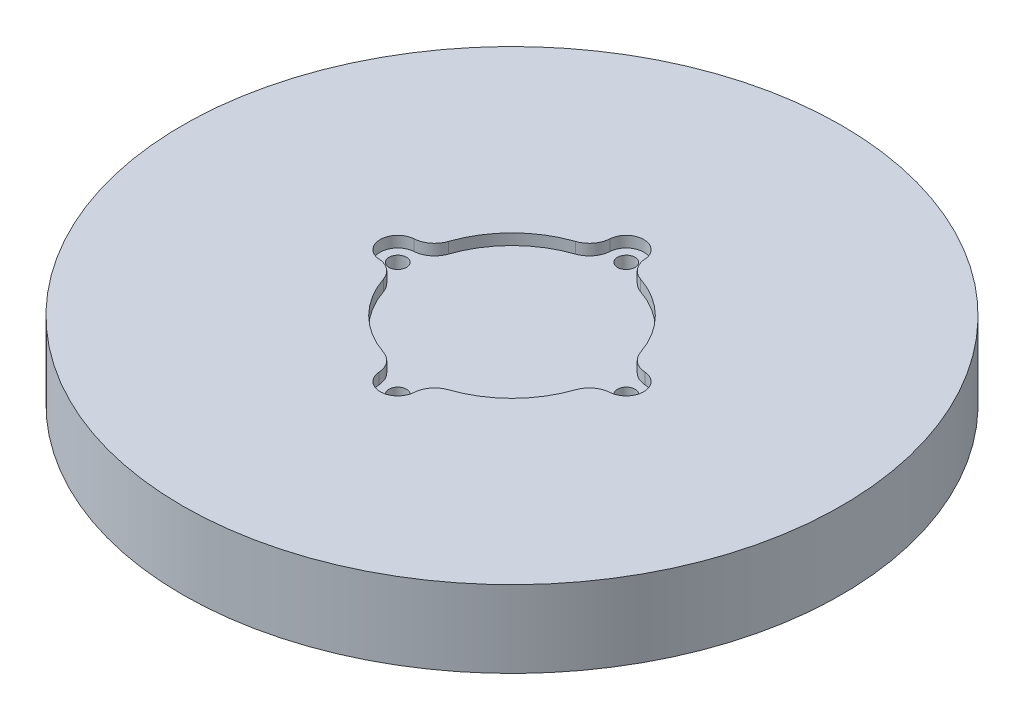
ISO-10303-21;
HEADER;
FILE_DESCRIPTION(('STEP AP214'),'2;1');
FILE_NAME('part.step','',(''),(''),'','','');
FILE_SCHEMA(('AUTOMOTIVE_DESIGN { 1 0 10303 214 1 1 1 1 }'));
ENDSEC;
DATA;
#1=APPLICATION_CONTEXT('core data for automotive mechanical design processes');
#2=APPLICATION_PROTOCOL_DEFINITION('international standard','automotive_design',2000,#1);
#3=PRODUCT_CONTEXT('',#1,'mechanical');
#4=PRODUCT('Part','Part','',(#3));
#5=PRODUCT_RELATED_PRODUCT_CATEGORY('part','',(#4));
#6=PRODUCT_DEFINITION_FORMATION('','',#4);
#7=PRODUCT_DEFINITION_CONTEXT('part definition',#1,'design');
#8=PRODUCT_DEFINITION('design','',#6,#7);
#9=PRODUCT_DEFINITION_SHAPE('','',#8);
#10=(LENGTH_UNIT() NAMED_UNIT(*) SI_UNIT(.MILLI.,.METRE.));
#11=(NAMED_UNIT(*) PLANE_ANGLE_UNIT() SI_UNIT($,.RADIAN.));
#12=(NAMED_UNIT(*) SI_UNIT($,.STERADIAN.) SOLID_ANGLE_UNIT());
#13=UNCERTAINTY_MEASURE_WITH_UNIT(LENGTH_MEASURE(1.E-05),#10,'distance_accuracy_value','');
#14=(GEOMETRIC_REPRESENTATION_CONTEXT(3) GLOBAL_UNCERTAINTY_ASSIGNED_CONTEXT((#13)) GLOBAL_UNIT_ASSIGNED_CONTEXT((#10,
#11,#12)) REPRESENTATION_CONTEXT('',''));
#15=CARTESIAN_POINT('',(0.,0.,0.));
#16=DIRECTION('',(0.,0.,1.));
#17=DIRECTION('',(1.,0.,0.));
#18=AXIS2_PLACEMENT_3D('',#15,#16,#17);
#19=CARTESIAN_POINT('',(0.,35.,0.));
#20=DIRECTION('',(0.,-1.,0.));
#21=DIRECTION('',(0.,0.,-1.));
#22=AXIS2_PLACEMENT_3D('',#19,#20,#21);
#23=CYLINDRICAL_SURFACE('',#22,150.);
#24=CARTESIAN_POINT('',(0.,35.,0.));
#25=DIRECTION('',(0.,1.,0.));
#26=DIRECTION('',(0.,0.,1.));
#27=AXIS2_PLACEMENT_3D('',#24,#25,#26);
#28=CIRCLE('',#27,150.);
#29=CARTESIAN_POINT('',(0.,35.,150.));
#30=VERTEX_POINT('',#29);
#31=EDGE_CURVE('E311',#30,#30,#28,.T.);
#32=ORIENTED_EDGE('',*,*,#31,.F.);
#33=EDGE_LOOP('',(#32));
#34=FACE_BOUND('',#33,.T.);
#35=CARTESIAN_POINT('',(0.,0.,0.));
#36=DIRECTION('',(0.,1.,0.));
#37=DIRECTION('',(0.,0.,1.));
#38=AXIS2_PLACEMENT_3D('',#35,#36,#37);
#39=CIRCLE('',#38,150.);
#40=CARTESIAN_POINT('',(0.,0.,150.));
#41=VERTEX_POINT('',#40);
#42=EDGE_CURVE('E287',#41,#41,#39,.T.);
#43=ORIENTED_EDGE('',*,*,#42,.T.);
#44=EDGE_LOOP('',(#43));
#45=FACE_BOUND('',#44,.T.);
#46=ADVANCED_FACE('F96',(#34,#45),#23,.T.);
#47=CARTESIAN_POINT('',(0.,35.,0.));
#48=DIRECTION('',(0.,1.,0.));
#49=DIRECTION('',(0.,0.,1.));
#50=AXIS2_PLACEMENT_3D('',#47,#48,#49);
#51=PLANE('',#50);
#52=CARTESIAN_POINT('',(0.,35.,0.));
#53=DIRECTION('',(0.,1.,0.));
#54=DIRECTION('',(0.,0.,1.));
#55=AXIS2_PLACEMENT_3D('',#52,#53,#54);
#56=CIRCLE('',#55,46.1388992574743);
#57=CARTESIAN_POINT('',(-43.7138322619308,35.,14.7613987706835));
#58=VERTEX_POINT('',#57);
#59=CARTESIAN_POINT('',(-14.761398770684,35.,43.7138322619306));
#60=VERTEX_POINT('',#59);
#61=EDGE_CURVE('E228',#58,#60,#56,.T.);
#62=ORIENTED_EDGE('',*,*,#61,.F.);
#63=CARTESIAN_POINT('',(-53.1882308638544,35.,17.9607379418044));
#64=DIRECTION('',(0.,1.,0.));
#65=DIRECTION('',(0.,0.,1.));
#66=AXIS2_PLACEMENT_3D('',#63,#64,#65);
#67=CIRCLE('',#66,10.);
#68=CARTESIAN_POINT('',(-52.5281026061575,35.,7.98255019635728));
#69=VERTEX_POINT('',#68);
#70=EDGE_CURVE('E210',#58,#69,#67,.T.);
#71=ORIENTED_EDGE('',*,*,#70,.T.);
#72=CARTESIAN_POINT('',(-52.,35.,-3.66583506191639E-13));
#73=DIRECTION('',(0.,1.,0.));
#74=DIRECTION('',(0.,0.,1.));
#75=AXIS2_PLACEMENT_3D('',#72,#73,#74);
#76=CIRCLE('',#75,7.99999999999999);
#77=CARTESIAN_POINT('',(-52.5281026061574,35.,-7.98255019635802));
#78=VERTEX_POINT('',#77);
#79=EDGE_CURVE('E241',#78,#69,#76,.T.);
#80=ORIENTED_EDGE('',*,*,#79,.F.);
#81=CARTESIAN_POINT('',(-53.1882308638542,35.,-17.9607379418051));
#82=DIRECTION('',(0.,1.,0.));
#83=DIRECTION('',(0.,0.,1.));
#84=AXIS2_PLACEMENT_3D('',#81,#82,#83);
#85=CIRCLE('',#84,10.);
#86=CARTESIAN_POINT('',(-43.7138322619306,35.,-14.7613987706841));
#87=VERTEX_POINT('',#86);
#88=EDGE_CURVE('E233',#78,#87,#85,.T.);
#89=ORIENTED_EDGE('',*,*,#88,.T.);
#90=CARTESIAN_POINT('',(-14.7613987706834,35.,-43.7138322619309));
#91=VERTEX_POINT('',#90);
#92=EDGE_CURVE('E244',#91,#87,#56,.T.);
#93=ORIENTED_EDGE('',*,*,#92,.F.);
#94=CARTESIAN_POINT('',(-17.9607379418042,35.,-53.1882308638545));
#95=DIRECTION('',(0.,1.,0.));
#96=DIRECTION('',(0.,0.,1.));
#97=AXIS2_PLACEMENT_3D('',#94,#95,#96);
#98=CIRCLE('',#97,10.);
#99=CARTESIAN_POINT('',(-7.98255019635711,35.,-52.5281026061575));
#100=VERTEX_POINT('',#99);
#101=EDGE_CURVE('E322',#91,#100,#98,.T.);
#102=ORIENTED_EDGE('',*,*,#101,.T.);
#103=CARTESIAN_POINT('',(5.44671088859529E-13,35.,-52.));
#104=DIRECTION('',(0.,1.,0.));
#105=DIRECTION('',(0.,0.,1.));
#106=AXIS2_PLACEMENT_3D('',#103,#104,#105);
#107=CIRCLE('',#106,8.);
#108=CARTESIAN_POINT('',(7.98255019635821,35.,-52.5281026061574));
#109=VERTEX_POINT('',#108);
#110=EDGE_CURVE('E259',#109,#100,#107,.T.);
#111=ORIENTED_EDGE('',*,*,#110,.F.);
#112=CARTESIAN_POINT('',(17.9607379418053,35.,-53.1882308638541));
#113=DIRECTION('',(0.,1.,0.));
#114=DIRECTION('',(0.,0.,1.));
#115=AXIS2_PLACEMENT_3D('',#112,#113,#114);
#116=CIRCLE('',#115,10.);
#117=CARTESIAN_POINT('',(14.7613987706843,35.,-43.7138322619305));
#118=VERTEX_POINT('',#117);
#119=EDGE_CURVE('E325',#109,#118,#116,.T.);
#120=ORIENTED_EDGE('',*,*,#119,.T.);
#121=CARTESIAN_POINT('',(43.7138322619307,35.,-14.7613987706838));
#122=VERTEX_POINT('',#121);
#123=EDGE_CURVE('E257',#122,#118,#56,.T.);
#124=ORIENTED_EDGE('',*,*,#123,.F.);
#125=CARTESIAN_POINT('',(53.1882308638543,35.,-17.9607379418047));
#126=DIRECTION('',(0.,1.,0.));
#127=DIRECTION('',(0.,0.,1.));
#128=AXIS2_PLACEMENT_3D('',#125,#126,#127);
#129=CIRCLE('',#128,10.);
#130=CARTESIAN_POINT('',(52.5281026061575,35.,-7.98255019635766));
#131=VERTEX_POINT('',#130);
#132=EDGE_CURVE('E328',#122,#131,#129,.T.);
#133=ORIENTED_EDGE('',*,*,#132,.T.);
#134=CARTESIAN_POINT('',(52.,35.,0.));
#135=DIRECTION('',(0.,1.,0.));
#136=DIRECTION('',(0.,0.,1.));
#137=AXIS2_PLACEMENT_3D('',#134,#135,#136);
#138=CIRCLE('',#137,8.);
#139=CARTESIAN_POINT('',(52.5281026061575,35.,7.98255019635766));
#140=VERTEX_POINT('',#139);
#141=EDGE_CURVE('E255',#140,#131,#138,.T.);
#142=ORIENTED_EDGE('',*,*,#141,.F.);
#143=CARTESIAN_POINT('',(53.1882308638543,35.,17.9607379418047));
#144=DIRECTION('',(0.,1.,0.));
#145=DIRECTION('',(0.,0.,1.));
#146=AXIS2_PLACEMENT_3D('',#143,#144,#145);
#147=CIRCLE('',#146,10.);
#148=CARTESIAN_POINT('',(43.7138322619307,35.,14.7613987706838));
#149=VERTEX_POINT('',#148);
#150=EDGE_CURVE('E331',#140,#149,#147,.T.);
#151=ORIENTED_EDGE('',*,*,#150,.T.);
#152=CARTESIAN_POINT('',(14.7613987706837,35.,43.7138322619307));
#153=VERTEX_POINT('',#152);
#154=EDGE_CURVE('E243',#153,#149,#56,.T.);
#155=ORIENTED_EDGE('',*,*,#154,.F.);
#156=CARTESIAN_POINT('',(17.9607379418045,35.,53.1882308638543));
#157=DIRECTION('',(0.,1.,0.));
#158=DIRECTION('',(0.,0.,1.));
#159=AXIS2_PLACEMENT_3D('',#156,#157,#158);
#160=CIRCLE('',#159,10.);
#161=CARTESIAN_POINT('',(7.98255019635747,35.,52.5281026061575));
#162=VERTEX_POINT('',#161);
#163=EDGE_CURVE('E334',#153,#162,#160,.T.);
#164=ORIENTED_EDGE('',*,*,#163,.T.);
#165=CARTESIAN_POINT('',(-1.81557029619843E-13,35.,52.));
#166=DIRECTION('',(0.,1.,0.));
#167=DIRECTION('',(0.,0.,1.));
#168=AXIS2_PLACEMENT_3D('',#165,#166,#167);
#169=CIRCLE('',#168,8.);
#170=CARTESIAN_POINT('',(-7.98255019635784,35.,52.5281026061574));
#171=VERTEX_POINT('',#170);
#172=EDGE_CURVE('E256',#171,#162,#169,.T.);
#173=ORIENTED_EDGE('',*,*,#172,.F.);
#174=CARTESIAN_POINT('',(-17.9607379418049,35.,53.1882308638542));
#175=DIRECTION('',(0.,1.,0.));
#176=DIRECTION('',(0.,0.,1.));
#177=AXIS2_PLACEMENT_3D('',#174,#175,#176);
#178=CIRCLE('',#177,10.);
#179=EDGE_CURVE('E222',#171,#60,#178,.T.);
#180=ORIENTED_EDGE('',*,*,#179,.T.);
#181=EDGE_LOOP('',(#62,#71,#80,#89,#93,#102,#111,#120,#124,#133,#142,#151,#155,#164,#173,#180));
#182=FACE_BOUND('',#181,.T.);
#183=ORIENTED_EDGE('',*,*,#31,.T.);
#184=EDGE_LOOP('',(#183));
#185=FACE_BOUND('',#184,.T.);
#186=ADVANCED_FACE('F236',(#182,#185),#51,.T.);
#187=CARTESIAN_POINT('',(0.,0.,0.));
#188=DIRECTION('',(0.,1.,0.));
#189=DIRECTION('',(0.,0.,1.));
#190=AXIS2_PLACEMENT_3D('',#187,#188,#189);
#191=PLANE('',#190);
#192=CARTESIAN_POINT('',(5.44671088859529E-13,0.,52.));
#193=DIRECTION('',(0.,-1.,0.));
#194=DIRECTION('',(0.,0.,-1.));
#195=AXIS2_PLACEMENT_3D('',#192,#193,#194);
#196=CIRCLE('',#195,4.);
#197=CARTESIAN_POINT('',(5.44671088859529E-13,0.,48.));
#198=VERTEX_POINT('',#197);
#199=EDGE_CURVE('E283',#198,#198,#196,.T.);
#200=ORIENTED_EDGE('',*,*,#199,.F.);
#201=EDGE_LOOP('',(#200));
#202=FACE_BOUND('',#201,.T.);
#203=CARTESIAN_POINT('',(-52.,0.,3.63114059239686E-13));
#204=DIRECTION('',(0.,-1.,0.));
#205=DIRECTION('',(0.,0.,-1.));
#206=AXIS2_PLACEMENT_3D('',#203,#204,#205);
#207=CIRCLE('',#206,4.);
#208=CARTESIAN_POINT('',(-52.,0.,-3.99999999999963));
#209=VERTEX_POINT('',#208);
#210=EDGE_CURVE('E288',#209,#209,#207,.T.);
#211=ORIENTED_EDGE('',*,*,#210,.F.);
#212=EDGE_LOOP('',(#211));
#213=FACE_BOUND('',#212,.T.);
#214=CARTESIAN_POINT('',(52.,0.,0.));
#215=DIRECTION('',(0.,-1.,0.));
#216=DIRECTION('',(0.,0.,-1.));
#217=AXIS2_PLACEMENT_3D('',#214,#215,#216);
#218=CIRCLE('',#217,4.);
#219=CARTESIAN_POINT('',(52.,0.,-4.));
#220=VERTEX_POINT('',#219);
#221=EDGE_CURVE('E292',#220,#220,#218,.T.);
#222=ORIENTED_EDGE('',*,*,#221,.F.);
#223=EDGE_LOOP('',(#222));
#224=FACE_BOUND('',#223,.T.);
#225=CARTESIAN_POINT('',(-1.81557029619843E-13,0.,-52.));
#226=DIRECTION('',(0.,-1.,0.));
#227=DIRECTION('',(0.,0.,-1.));
#228=AXIS2_PLACEMENT_3D('',#225,#226,#227);
#229=CIRCLE('',#228,4.);
#230=CARTESIAN_POINT('',(-1.81557029619843E-13,0.,-56.));
#231=VERTEX_POINT('',#230);
#232=EDGE_CURVE('E300',#231,#231,#229,.T.);
#233=ORIENTED_EDGE('',*,*,#232,.F.);
#234=EDGE_LOOP('',(#233));
#235=FACE_BOUND('',#234,.T.);
#236=ORIENTED_EDGE('',*,*,#42,.F.);
#237=EDGE_LOOP('',(#236));
#238=FACE_BOUND('',#237,.T.);
#239=ADVANCED_FACE('F487',(#202,#213,#224,#235,#238),#191,.F.);
#240=CARTESIAN_POINT('',(-1.81557029619843E-13,30.,-52.));
#241=DIRECTION('',(0.,-1.,0.));
#242=DIRECTION('',(0.,0.,-1.));
#243=AXIS2_PLACEMENT_3D('',#240,#241,#242);
#244=CYLINDRICAL_SURFACE('',#243,4.);
#245=CARTESIAN_POINT('',(-1.81557029619843E-13,30.,-52.));
#246=DIRECTION('',(0.,-1.,0.));
#247=DIRECTION('',(0.,0.,-1.));
#248=AXIS2_PLACEMENT_3D('',#245,#246,#247);
#249=CIRCLE('',#248,4.);
#250=CARTESIAN_POINT('',(-1.81557029619843E-13,30.,-56.));
#251=VERTEX_POINT('',#250);
#252=EDGE_CURVE('E304',#251,#251,#249,.T.);
#253=ORIENTED_EDGE('',*,*,#252,.F.);
#254=EDGE_LOOP('',(#253));
#255=FACE_BOUND('',#254,.T.);
#256=ORIENTED_EDGE('',*,*,#232,.T.);
#257=EDGE_LOOP('',(#256));
#258=FACE_BOUND('',#257,.T.);
#259=ADVANCED_FACE('F492',(#255,#258),#244,.F.);
#260=CARTESIAN_POINT('',(52.,30.,0.));
#261=DIRECTION('',(0.,-1.,0.));
#262=DIRECTION('',(0.,0.,-1.));
#263=AXIS2_PLACEMENT_3D('',#260,#261,#262);
#264=CYLINDRICAL_SURFACE('',#263,4.);
#265=CARTESIAN_POINT('',(52.,30.,0.));
#266=DIRECTION('',(0.,-1.,0.));
#267=DIRECTION('',(0.,0.,-1.));
#268=AXIS2_PLACEMENT_3D('',#265,#266,#267);
#269=CIRCLE('',#268,4.);
#270=CARTESIAN_POINT('',(52.,30.,-4.));
#271=VERTEX_POINT('',#270);
#272=EDGE_CURVE('E296',#271,#271,#269,.T.);
#273=ORIENTED_EDGE('',*,*,#272,.F.);
#274=EDGE_LOOP('',(#273));
#275=FACE_BOUND('',#274,.T.);
#276=ORIENTED_EDGE('',*,*,#221,.T.);
#277=EDGE_LOOP('',(#276));
#278=FACE_BOUND('',#277,.T.);
#279=ADVANCED_FACE('F497',(#275,#278),#264,.F.);
#280=CARTESIAN_POINT('',(-52.,30.,3.63114059239686E-13));
#281=DIRECTION('',(0.,-1.,0.));
#282=DIRECTION('',(0.,0.,-1.));
#283=AXIS2_PLACEMENT_3D('',#280,#281,#282);
#284=CYLINDRICAL_SURFACE('',#283,4.);
#285=CARTESIAN_POINT('',(-52.,30.,3.63114059239686E-13));
#286=DIRECTION('',(0.,-1.,0.));
#287=DIRECTION('',(0.,0.,-1.));
#288=AXIS2_PLACEMENT_3D('',#285,#286,#287);
#289=CIRCLE('',#288,4.);
#290=CARTESIAN_POINT('',(-52.,30.,-3.99999999999963));
#291=VERTEX_POINT('',#290);
#292=EDGE_CURVE('E282',#291,#291,#289,.T.);
#293=ORIENTED_EDGE('',*,*,#292,.F.);
#294=EDGE_LOOP('',(#293));
#295=FACE_BOUND('',#294,.T.);
#296=ORIENTED_EDGE('',*,*,#210,.T.);
#297=EDGE_LOOP('',(#296));
#298=FACE_BOUND('',#297,.T.);
#299=ADVANCED_FACE('F501',(#295,#298),#284,.F.);
#300=CARTESIAN_POINT('',(5.44671088859529E-13,30.,52.));
#301=DIRECTION('',(0.,-1.,0.));
#302=DIRECTION('',(0.,0.,-1.));
#303=AXIS2_PLACEMENT_3D('',#300,#301,#302);
#304=CYLINDRICAL_SURFACE('',#303,4.);
#305=CARTESIAN_POINT('',(5.44671088859529E-13,30.,52.));
#306=DIRECTION('',(0.,-1.,0.));
#307=DIRECTION('',(0.,0.,-1.));
#308=AXIS2_PLACEMENT_3D('',#305,#306,#307);
#309=CIRCLE('',#308,4.);
#310=CARTESIAN_POINT('',(5.44671088859529E-13,30.,48.));
#311=VERTEX_POINT('',#310);
#312=EDGE_CURVE('E278',#311,#311,#309,.T.);
#313=ORIENTED_EDGE('',*,*,#312,.F.);
#314=EDGE_LOOP('',(#313));
#315=FACE_BOUND('',#314,.T.);
#316=ORIENTED_EDGE('',*,*,#199,.T.);
#317=EDGE_LOOP('',(#316));
#318=FACE_BOUND('',#317,.T.);
#319=ADVANCED_FACE('F505',(#315,#318),#304,.F.);
#320=CARTESIAN_POINT('',(0.,30.,0.));
#321=DIRECTION('',(0.,1.,0.));
#322=DIRECTION('',(0.,0.,1.));
#323=AXIS2_PLACEMENT_3D('',#320,#321,#322);
#324=PLANE('',#323);
#325=CARTESIAN_POINT('',(-1.81557029619843E-13,30.,52.));
#326=DIRECTION('',(0.,1.,0.));
#327=DIRECTION('',(0.,0.,1.));
#328=AXIS2_PLACEMENT_3D('',#325,#326,#327);
#329=CIRCLE('',#328,8.);
#330=CARTESIAN_POINT('',(-7.98255019635784,30.,52.5281026061574));
#331=VERTEX_POINT('',#330);
#332=CARTESIAN_POINT('',(7.98255019635747,30.,52.5281026061575));
#333=VERTEX_POINT('',#332);
#334=EDGE_CURVE('E240',#331,#333,#329,.T.);
#335=ORIENTED_EDGE('',*,*,#334,.T.);
#336=CARTESIAN_POINT('',(17.9607379418045,30.,53.1882308638543));
#337=DIRECTION('',(0.,1.,0.));
#338=DIRECTION('',(0.,0.,1.));
#339=AXIS2_PLACEMENT_3D('',#336,#337,#338);
#340=CIRCLE('',#339,10.);
#341=CARTESIAN_POINT('',(14.7613987706837,30.,43.7138322619307));
#342=VERTEX_POINT('',#341);
#343=EDGE_CURVE('E388',#333,#342,#340,.F.);
#344=ORIENTED_EDGE('',*,*,#343,.T.);
#345=CARTESIAN_POINT('',(0.,30.,0.));
#346=DIRECTION('',(0.,1.,0.));
#347=DIRECTION('',(0.,0.,1.));
#348=AXIS2_PLACEMENT_3D('',#345,#346,#347);
#349=CIRCLE('',#348,46.1388992574743);
#350=CARTESIAN_POINT('',(43.7138322619307,30.,14.7613987706838));
#351=VERTEX_POINT('',#350);
#352=EDGE_CURVE('E248',#342,#351,#349,.T.);
#353=ORIENTED_EDGE('',*,*,#352,.T.);
#354=CARTESIAN_POINT('',(53.1882308638543,30.,17.9607379418047));
#355=DIRECTION('',(0.,1.,0.));
#356=DIRECTION('',(0.,0.,1.));
#357=AXIS2_PLACEMENT_3D('',#354,#355,#356);
#358=CIRCLE('',#357,10.);
#359=CARTESIAN_POINT('',(52.5281026061575,30.,7.98255019635766));
#360=VERTEX_POINT('',#359);
#361=EDGE_CURVE('E391',#351,#360,#358,.F.);
#362=ORIENTED_EDGE('',*,*,#361,.T.);
#363=CARTESIAN_POINT('',(52.,30.,0.));
#364=DIRECTION('',(0.,1.,0.));
#365=DIRECTION('',(0.,0.,1.));
#366=AXIS2_PLACEMENT_3D('',#363,#364,#365);
#367=CIRCLE('',#366,8.);
#368=CARTESIAN_POINT('',(52.5281026061575,30.,-7.98255019635766));
#369=VERTEX_POINT('',#368);
#370=EDGE_CURVE('E415',#360,#369,#367,.T.);
#371=ORIENTED_EDGE('',*,*,#370,.T.);
#372=CARTESIAN_POINT('',(53.1882308638543,30.,-17.9607379418047));
#373=DIRECTION('',(0.,1.,0.));
#374=DIRECTION('',(0.,0.,1.));
#375=AXIS2_PLACEMENT_3D('',#372,#373,#374);
#376=CIRCLE('',#375,10.);
#377=CARTESIAN_POINT('',(43.7138322619307,30.,-14.7613987706838));
#378=VERTEX_POINT('',#377);
#379=EDGE_CURVE('E394',#369,#378,#376,.F.);
#380=ORIENTED_EDGE('',*,*,#379,.T.);
#381=CARTESIAN_POINT('',(14.7613987706843,30.,-43.7138322619305));
#382=VERTEX_POINT('',#381);
#383=EDGE_CURVE('E410',#378,#382,#349,.T.);
#384=ORIENTED_EDGE('',*,*,#383,.T.);
#385=CARTESIAN_POINT('',(17.9607379418053,30.,-53.1882308638541));
#386=DIRECTION('',(0.,1.,0.));
#387=DIRECTION('',(0.,0.,1.));
#388=AXIS2_PLACEMENT_3D('',#385,#386,#387);
#389=CIRCLE('',#388,10.);
#390=CARTESIAN_POINT('',(7.98255019635821,30.,-52.5281026061574));
#391=VERTEX_POINT('',#390);
#392=EDGE_CURVE('E397',#382,#391,#389,.F.);
#393=ORIENTED_EDGE('',*,*,#392,.T.);
#394=CARTESIAN_POINT('',(5.44671088859529E-13,30.,-52.));
#395=DIRECTION('',(0.,1.,0.));
#396=DIRECTION('',(0.,0.,1.));
#397=AXIS2_PLACEMENT_3D('',#394,#395,#396);
#398=CIRCLE('',#397,8.);
#399=CARTESIAN_POINT('',(-7.98255019635711,30.,-52.5281026061575));
#400=VERTEX_POINT('',#399);
#401=EDGE_CURVE('E409',#391,#400,#398,.T.);
#402=ORIENTED_EDGE('',*,*,#401,.T.);
#403=CARTESIAN_POINT('',(-17.9607379418042,30.,-53.1882308638545));
#404=DIRECTION('',(0.,1.,0.));
#405=DIRECTION('',(0.,0.,1.));
#406=AXIS2_PLACEMENT_3D('',#403,#404,#405);
#407=CIRCLE('',#406,10.);
#408=CARTESIAN_POINT('',(-14.7613987706834,30.,-43.7138322619309));
#409=VERTEX_POINT('',#408);
#410=EDGE_CURVE('E105',#400,#409,#407,.F.);
#411=ORIENTED_EDGE('',*,*,#410,.T.);
#412=CARTESIAN_POINT('',(-43.7138322619306,30.,-14.7613987706841));
#413=VERTEX_POINT('',#412);
#414=EDGE_CURVE('E404',#409,#413,#349,.T.);
#415=ORIENTED_EDGE('',*,*,#414,.T.);
#416=CARTESIAN_POINT('',(-53.1882308638542,30.,-17.9607379418051));
#417=DIRECTION('',(0.,1.,0.));
#418=DIRECTION('',(0.,0.,1.));
#419=AXIS2_PLACEMENT_3D('',#416,#417,#418);
#420=CIRCLE('',#419,10.);
#421=CARTESIAN_POINT('',(-52.5281026061574,30.,-7.98255019635802));
#422=VERTEX_POINT('',#421);
#423=EDGE_CURVE('E12',#413,#422,#420,.F.);
#424=ORIENTED_EDGE('',*,*,#423,.T.);
#425=CARTESIAN_POINT('',(-52.,30.,-3.66583506191639E-13));
#426=DIRECTION('',(0.,1.,0.));
#427=DIRECTION('',(0.,0.,1.));
#428=AXIS2_PLACEMENT_3D('',#425,#426,#427);
#429=CIRCLE('',#428,7.99999999999999);
#430=CARTESIAN_POINT('',(-52.5281026061575,30.,7.98255019635728));
#431=VERTEX_POINT('',#430);
#432=EDGE_CURVE('E402',#422,#431,#429,.T.);
#433=ORIENTED_EDGE('',*,*,#432,.T.);
#434=CARTESIAN_POINT('',(-53.1882308638544,30.,17.9607379418044));
#435=DIRECTION('',(0.,1.,0.));
#436=DIRECTION('',(0.,0.,1.));
#437=AXIS2_PLACEMENT_3D('',#434,#435,#436);
#438=CIRCLE('',#437,10.);
#439=CARTESIAN_POINT('',(-43.7138322619308,30.,14.7613987706835));
#440=VERTEX_POINT('',#439);
#441=EDGE_CURVE('E382',#431,#440,#438,.F.);
#442=ORIENTED_EDGE('',*,*,#441,.T.);
#443=CARTESIAN_POINT('',(-14.761398770684,30.,43.7138322619306));
#444=VERTEX_POINT('',#443);
#445=EDGE_CURVE('E231',#440,#444,#349,.T.);
#446=ORIENTED_EDGE('',*,*,#445,.T.);
#447=CARTESIAN_POINT('',(-17.9607379418049,30.,53.1882308638542));
#448=DIRECTION('',(0.,1.,0.));
#449=DIRECTION('',(0.,0.,1.));
#450=AXIS2_PLACEMENT_3D('',#447,#448,#449);
#451=CIRCLE('',#450,10.);
#452=EDGE_CURVE('E385',#444,#331,#451,.F.);
#453=ORIENTED_EDGE('',*,*,#452,.T.);
#454=EDGE_LOOP('',(#335,#344,#353,#362,#371,#380,#384,#393,#402,#411,#415,#424,#433,#442,#446,#453));
#455=FACE_BOUND('',#454,.T.);
#456=ORIENTED_EDGE('',*,*,#312,.T.);
#457=EDGE_LOOP('',(#456));
#458=FACE_BOUND('',#457,.T.);
#459=ORIENTED_EDGE('',*,*,#292,.T.);
#460=EDGE_LOOP('',(#459));
#461=FACE_BOUND('',#460,.T.);
#462=ORIENTED_EDGE('',*,*,#272,.T.);
#463=EDGE_LOOP('',(#462));
#464=FACE_BOUND('',#463,.T.);
#465=ORIENTED_EDGE('',*,*,#252,.T.);
#466=EDGE_LOOP('',(#465));
#467=FACE_BOUND('',#466,.T.);
#468=ADVANCED_FACE('F433',(#455,#458,#461,#464,#467),#324,.T.);
#469=CARTESIAN_POINT('',(-1.81557029619843E-13,30.,52.));
#470=DIRECTION('',(0.,1.,0.));
#471=DIRECTION('',(0.,0.,1.));
#472=AXIS2_PLACEMENT_3D('',#469,#470,#471);
#473=CYLINDRICAL_SURFACE('',#472,8.);
#474=ORIENTED_EDGE('',*,*,#334,.F.);
#475=DIRECTION('',(0.,1.,0.));
#476=VECTOR('',#475,1.);
#477=CARTESIAN_POINT('',(-7.98255019635784,30.,52.5281026061574));
#478=LINE('',#477,#476);
#479=EDGE_CURVE('E347',#331,#171,#478,.T.);
#480=ORIENTED_EDGE('',*,*,#479,.T.);
#481=ORIENTED_EDGE('',*,*,#172,.T.);
#482=DIRECTION('',(0.,1.,0.));
#483=VECTOR('',#482,1.);
#484=CARTESIAN_POINT('',(7.98255019635747,30.,52.5281026061575));
#485=LINE('',#484,#483);
#486=EDGE_CURVE('E344',#162,#333,#485,.F.);
#487=ORIENTED_EDGE('',*,*,#486,.T.);
#488=EDGE_LOOP('',(#474,#480,#481,#487));
#489=FACE_BOUND('',#488,.T.);
#490=ADVANCED_FACE('F427',(#489),#473,.F.);
#491=CARTESIAN_POINT('',(0.,30.,0.));
#492=DIRECTION('',(0.,1.,0.));
#493=DIRECTION('',(0.,0.,1.));
#494=AXIS2_PLACEMENT_3D('',#491,#492,#493);
#495=CYLINDRICAL_SURFACE('',#494,46.1388992574743);
#496=ORIENTED_EDGE('',*,*,#445,.F.);
#497=DIRECTION('',(0.,1.,0.));
#498=VECTOR('',#497,1.);
#499=CARTESIAN_POINT('',(-43.7138322619308,30.,14.7613987706835));
#500=LINE('',#499,#498);
#501=EDGE_CURVE('E214',#440,#58,#500,.T.);
#502=ORIENTED_EDGE('',*,*,#501,.T.);
#503=ORIENTED_EDGE('',*,*,#61,.T.);
#504=DIRECTION('',(0.,1.,0.));
#505=VECTOR('',#504,1.);
#506=CARTESIAN_POINT('',(-14.761398770684,30.,43.7138322619306));
#507=LINE('',#506,#505);
#508=EDGE_CURVE('E234',#60,#444,#507,.F.);
#509=ORIENTED_EDGE('',*,*,#508,.T.);
#510=EDGE_LOOP('',(#496,#502,#503,#509));
#511=FACE_BOUND('',#510,.T.);
#512=ADVANCED_FACE('F227',(#511),#495,.F.);
#513=CARTESIAN_POINT('',(-52.,30.,-3.66583506191639E-13));
#514=DIRECTION('',(0.,1.,0.));
#515=DIRECTION('',(0.,0.,1.));
#516=AXIS2_PLACEMENT_3D('',#513,#514,#515);
#517=CYLINDRICAL_SURFACE('',#516,7.99999999999999);
#518=ORIENTED_EDGE('',*,*,#79,.T.);
#519=DIRECTION('',(0.,1.,0.));
#520=VECTOR('',#519,1.);
#521=CARTESIAN_POINT('',(-52.5281026061575,30.,7.98255019635728));
#522=LINE('',#521,#520);
#523=EDGE_CURVE('E215',#69,#431,#522,.F.);
#524=ORIENTED_EDGE('',*,*,#523,.T.);
#525=ORIENTED_EDGE('',*,*,#432,.F.);
#526=DIRECTION('',(0.,1.,0.));
#527=VECTOR('',#526,1.);
#528=CARTESIAN_POINT('',(-52.5281026061574,30.,-7.98255019635802));
#529=LINE('',#528,#527);
#530=EDGE_CURVE('E221',#422,#78,#529,.T.);
#531=ORIENTED_EDGE('',*,*,#530,.T.);
#532=EDGE_LOOP('',(#518,#524,#525,#531));
#533=FACE_BOUND('',#532,.T.);
#534=ADVANCED_FACE('F468',(#533),#517,.F.);
#535=ORIENTED_EDGE('',*,*,#414,.F.);
#536=DIRECTION('',(0.,1.,0.));
#537=VECTOR('',#536,1.);
#538=CARTESIAN_POINT('',(-14.7613987706834,30.,-43.7138322619309));
#539=LINE('',#538,#537);
#540=EDGE_CURVE('E379',#409,#91,#539,.T.);
#541=ORIENTED_EDGE('',*,*,#540,.T.);
#542=ORIENTED_EDGE('',*,*,#92,.T.);
#543=DIRECTION('',(0.,1.,0.));
#544=VECTOR('',#543,1.);
#545=CARTESIAN_POINT('',(-43.7138322619306,30.,-14.7613987706841));
#546=LINE('',#545,#544);
#547=EDGE_CURVE('E112',#87,#413,#546,.F.);
#548=ORIENTED_EDGE('',*,*,#547,.T.);
#549=EDGE_LOOP('',(#535,#541,#542,#548));
#550=FACE_BOUND('',#549,.T.);
#551=ADVANCED_FACE('F462',(#550),#495,.F.);
#552=CARTESIAN_POINT('',(5.44671088859529E-13,30.,-52.));
#553=DIRECTION('',(0.,1.,0.));
#554=DIRECTION('',(0.,0.,1.));
#555=AXIS2_PLACEMENT_3D('',#552,#553,#554);
#556=CYLINDRICAL_SURFACE('',#555,8.);
#557=ORIENTED_EDGE('',*,*,#401,.F.);
#558=DIRECTION('',(0.,1.,0.));
#559=VECTOR('',#558,1.);
#560=CARTESIAN_POINT('',(7.98255019635821,30.,-52.5281026061574));
#561=LINE('',#560,#559);
#562=EDGE_CURVE('E373',#391,#109,#561,.T.);
#563=ORIENTED_EDGE('',*,*,#562,.T.);
#564=ORIENTED_EDGE('',*,*,#110,.T.);
#565=DIRECTION('',(0.,1.,0.));
#566=VECTOR('',#565,1.);
#567=CARTESIAN_POINT('',(-7.98255019635711,30.,-52.5281026061575));
#568=LINE('',#567,#566);
#569=EDGE_CURVE('E370',#100,#400,#568,.F.);
#570=ORIENTED_EDGE('',*,*,#569,.T.);
#571=EDGE_LOOP('',(#557,#563,#564,#570));
#572=FACE_BOUND('',#571,.T.);
#573=ADVANCED_FACE('F456',(#572),#556,.F.);
#574=ORIENTED_EDGE('',*,*,#383,.F.);
#575=DIRECTION('',(0.,1.,0.));
#576=VECTOR('',#575,1.);
#577=CARTESIAN_POINT('',(43.7138322619307,30.,-14.7613987706838));
#578=LINE('',#577,#576);
#579=EDGE_CURVE('E367',#378,#122,#578,.T.);
#580=ORIENTED_EDGE('',*,*,#579,.T.);
#581=ORIENTED_EDGE('',*,*,#123,.T.);
#582=DIRECTION('',(0.,1.,0.));
#583=VECTOR('',#582,1.);
#584=CARTESIAN_POINT('',(14.7613987706843,30.,-43.7138322619305));
#585=LINE('',#584,#583);
#586=EDGE_CURVE('E364',#118,#382,#585,.F.);
#587=ORIENTED_EDGE('',*,*,#586,.T.);
#588=EDGE_LOOP('',(#574,#580,#581,#587));
#589=FACE_BOUND('',#588,.T.);
#590=ADVANCED_FACE('F450',(#589),#495,.F.);
#591=CARTESIAN_POINT('',(52.,30.,0.));
#592=DIRECTION('',(0.,1.,0.));
#593=DIRECTION('',(0.,0.,1.));
#594=AXIS2_PLACEMENT_3D('',#591,#592,#593);
#595=CYLINDRICAL_SURFACE('',#594,8.);
#596=ORIENTED_EDGE('',*,*,#370,.F.);
#597=DIRECTION('',(0.,1.,0.));
#598=VECTOR('',#597,1.);
#599=CARTESIAN_POINT('',(52.5281026061575,30.,7.98255019635766));
#600=LINE('',#599,#598);
#601=EDGE_CURVE('E361',#360,#140,#600,.T.);
#602=ORIENTED_EDGE('',*,*,#601,.T.);
#603=ORIENTED_EDGE('',*,*,#141,.T.);
#604=DIRECTION('',(0.,1.,0.));
#605=VECTOR('',#604,1.);
#606=CARTESIAN_POINT('',(52.5281026061575,30.,-7.98255019635766));
#607=LINE('',#606,#605);
#608=EDGE_CURVE('E358',#131,#369,#607,.F.);
#609=ORIENTED_EDGE('',*,*,#608,.T.);
#610=EDGE_LOOP('',(#596,#602,#603,#609));
#611=FACE_BOUND('',#610,.T.);
#612=ADVANCED_FACE('F444',(#611),#595,.F.);
#613=ORIENTED_EDGE('',*,*,#352,.F.);
#614=DIRECTION('',(0.,1.,0.));
#615=VECTOR('',#614,1.);
#616=CARTESIAN_POINT('',(14.7613987706837,30.,43.7138322619307));
#617=LINE('',#616,#615);
#618=EDGE_CURVE('E354',#342,#153,#617,.T.);
#619=ORIENTED_EDGE('',*,*,#618,.T.);
#620=ORIENTED_EDGE('',*,*,#154,.T.);
#621=DIRECTION('',(0.,1.,0.));
#622=VECTOR('',#621,1.);
#623=CARTESIAN_POINT('',(43.7138322619307,30.,14.7613987706838));
#624=LINE('',#623,#622);
#625=EDGE_CURVE('E351',#149,#351,#624,.F.);
#626=ORIENTED_EDGE('',*,*,#625,.T.);
#627=EDGE_LOOP('',(#613,#619,#620,#626));
#628=FACE_BOUND('',#627,.T.);
#629=ADVANCED_FACE('F436',(#628),#495,.F.);
#630=CARTESIAN_POINT('',(-53.1882308638544,30.,17.9607379418044));
#631=DIRECTION('',(0.,1.,0.));
#632=DIRECTION('',(0.,0.,1.));
#633=AXIS2_PLACEMENT_3D('',#630,#631,#632);
#634=CYLINDRICAL_SURFACE('',#633,10.);
#635=ORIENTED_EDGE('',*,*,#441,.F.);
#636=ORIENTED_EDGE('',*,*,#523,.F.);
#637=ORIENTED_EDGE('',*,*,#70,.F.);
#638=ORIENTED_EDGE('',*,*,#501,.F.);
#639=EDGE_LOOP('',(#635,#636,#637,#638));
#640=FACE_BOUND('',#639,.T.);
#641=ADVANCED_FACE('F213',(#640),#634,.T.);
#642=CARTESIAN_POINT('',(-17.9607379418049,30.,53.1882308638542));
#643=DIRECTION('',(0.,1.,0.));
#644=DIRECTION('',(0.,0.,1.));
#645=AXIS2_PLACEMENT_3D('',#642,#643,#644);
#646=CYLINDRICAL_SURFACE('',#645,10.);
#647=ORIENTED_EDGE('',*,*,#452,.F.);
#648=ORIENTED_EDGE('',*,*,#508,.F.);
#649=ORIENTED_EDGE('',*,*,#179,.F.);
#650=ORIENTED_EDGE('',*,*,#479,.F.);
#651=EDGE_LOOP('',(#647,#648,#649,#650));
#652=FACE_BOUND('',#651,.T.);
#653=ADVANCED_FACE('F471',(#652),#646,.T.);
#654=CARTESIAN_POINT('',(17.9607379418045,30.,53.1882308638543));
#655=DIRECTION('',(0.,1.,0.));
#656=DIRECTION('',(0.,0.,1.));
#657=AXIS2_PLACEMENT_3D('',#654,#655,#656);
#658=CYLINDRICAL_SURFACE('',#657,10.);
#659=ORIENTED_EDGE('',*,*,#343,.F.);
#660=ORIENTED_EDGE('',*,*,#486,.F.);
#661=ORIENTED_EDGE('',*,*,#163,.F.);
#662=ORIENTED_EDGE('',*,*,#618,.F.);
#663=EDGE_LOOP('',(#659,#660,#661,#662));
#664=FACE_BOUND('',#663,.T.);
#665=ADVANCED_FACE('F431',(#664),#658,.T.);
#666=CARTESIAN_POINT('',(53.1882308638543,30.,17.9607379418047));
#667=DIRECTION('',(0.,1.,0.));
#668=DIRECTION('',(0.,0.,1.));
#669=AXIS2_PLACEMENT_3D('',#666,#667,#668);
#670=CYLINDRICAL_SURFACE('',#669,10.);
#671=ORIENTED_EDGE('',*,*,#361,.F.);
#672=ORIENTED_EDGE('',*,*,#625,.F.);
#673=ORIENTED_EDGE('',*,*,#150,.F.);
#674=ORIENTED_EDGE('',*,*,#601,.F.);
#675=EDGE_LOOP('',(#671,#672,#673,#674));
#676=FACE_BOUND('',#675,.T.);
#677=ADVANCED_FACE('F440',(#676),#670,.T.);
#678=CARTESIAN_POINT('',(53.1882308638543,30.,-17.9607379418047));
#679=DIRECTION('',(0.,1.,0.));
#680=DIRECTION('',(0.,0.,1.));
#681=AXIS2_PLACEMENT_3D('',#678,#679,#680);
#682=CYLINDRICAL_SURFACE('',#681,10.);
#683=ORIENTED_EDGE('',*,*,#379,.F.);
#684=ORIENTED_EDGE('',*,*,#608,.F.);
#685=ORIENTED_EDGE('',*,*,#132,.F.);
#686=ORIENTED_EDGE('',*,*,#579,.F.);
#687=EDGE_LOOP('',(#683,#684,#685,#686));
#688=FACE_BOUND('',#687,.T.);
#689=ADVANCED_FACE('F446',(#688),#682,.T.);
#690=CARTESIAN_POINT('',(17.9607379418053,30.,-53.1882308638541));
#691=DIRECTION('',(0.,1.,0.));
#692=DIRECTION('',(0.,0.,1.));
#693=AXIS2_PLACEMENT_3D('',#690,#691,#692);
#694=CYLINDRICAL_SURFACE('',#693,10.);
#695=ORIENTED_EDGE('',*,*,#392,.F.);
#696=ORIENTED_EDGE('',*,*,#586,.F.);
#697=ORIENTED_EDGE('',*,*,#119,.F.);
#698=ORIENTED_EDGE('',*,*,#562,.F.);
#699=EDGE_LOOP('',(#695,#696,#697,#698));
#700=FACE_BOUND('',#699,.T.);
#701=ADVANCED_FACE('F452',(#700),#694,.T.);
#702=CARTESIAN_POINT('',(-17.9607379418042,30.,-53.1882308638545));
#703=DIRECTION('',(0.,1.,0.));
#704=DIRECTION('',(0.,0.,1.));
#705=AXIS2_PLACEMENT_3D('',#702,#703,#704);
#706=CYLINDRICAL_SURFACE('',#705,10.);
#707=ORIENTED_EDGE('',*,*,#410,.F.);
#708=ORIENTED_EDGE('',*,*,#569,.F.);
#709=ORIENTED_EDGE('',*,*,#101,.F.);
#710=ORIENTED_EDGE('',*,*,#540,.F.);
#711=EDGE_LOOP('',(#707,#708,#709,#710));
#712=FACE_BOUND('',#711,.T.);
#713=ADVANCED_FACE('F460',(#712),#706,.T.);
#714=CARTESIAN_POINT('',(-53.1882308638542,30.,-17.9607379418051));
#715=DIRECTION('',(0.,1.,0.));
#716=DIRECTION('',(0.,0.,1.));
#717=AXIS2_PLACEMENT_3D('',#714,#715,#716);
#718=CYLINDRICAL_SURFACE('',#717,10.);
#719=ORIENTED_EDGE('',*,*,#423,.F.);
#720=ORIENTED_EDGE('',*,*,#547,.F.);
#721=ORIENTED_EDGE('',*,*,#88,.F.);
#722=ORIENTED_EDGE('',*,*,#530,.F.);
#723=EDGE_LOOP('',(#719,#720,#721,#722));
#724=FACE_BOUND('',#723,.T.);
#725=ADVANCED_FACE('F98',(#724),#718,.T.);
#726=CLOSED_SHELL('',(#46,#186,#239,#259,#279,#299,#319,#468,#490,#512,#534,#551,#573,#590,#612,
#629,#641,#653,#665,#677,#689,#701,#713,#725));
#727=MANIFOLD_SOLID_BREP('B2',#726);
#728=ADVANCED_BREP_SHAPE_REPRESENTATION('',(#18,#727),#14);
#729=SHAPE_DEFINITION_REPRESENTATION(#9,#728);
ENDSEC;
END-ISO-10303-21;
